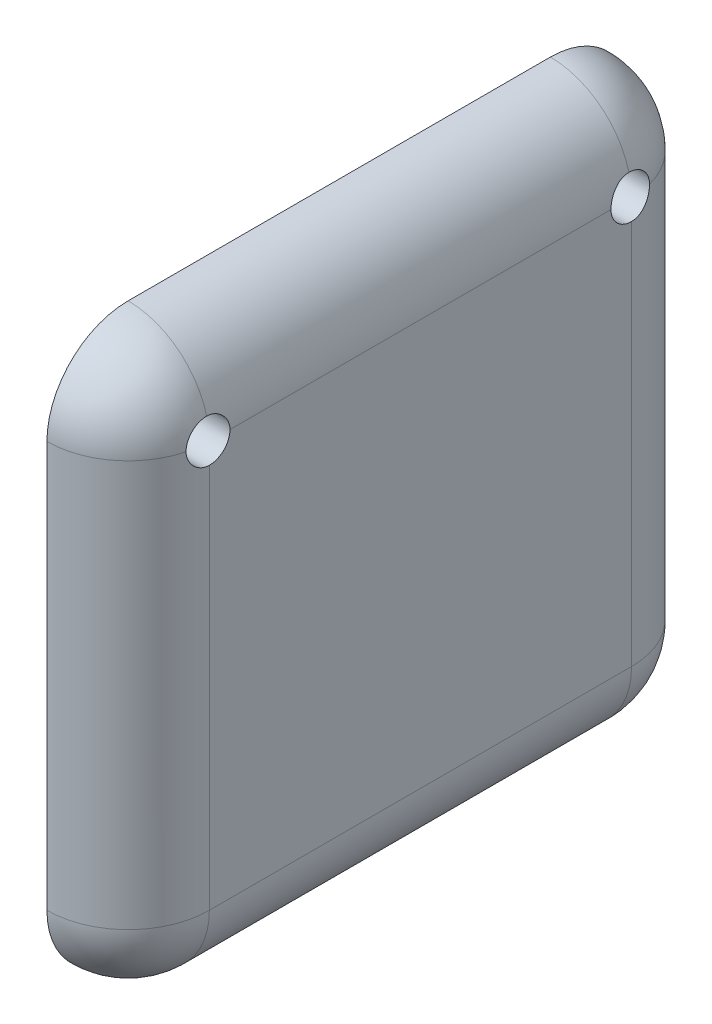
ISO-10303-21;
HEADER;
FILE_DESCRIPTION(('STEP AP214'),'2;1');
FILE_NAME('part.step','',(''),(''),'','','');
FILE_SCHEMA(('AUTOMOTIVE_DESIGN { 1 0 10303 214 1 1 1 1 }'));
ENDSEC;
DATA;
#1=APPLICATION_CONTEXT('core data for automotive mechanical design processes');
#2=APPLICATION_PROTOCOL_DEFINITION('international standard','automotive_design',2000,#1);
#3=PRODUCT_CONTEXT('',#1,'mechanical');
#4=PRODUCT('Part','Part','',(#3));
#5=PRODUCT_RELATED_PRODUCT_CATEGORY('part','',(#4));
#6=PRODUCT_DEFINITION_FORMATION('','',#4);
#7=PRODUCT_DEFINITION_CONTEXT('part definition',#1,'design');
#8=PRODUCT_DEFINITION('design','',#6,#7);
#9=PRODUCT_DEFINITION_SHAPE('','',#8);
#10=(LENGTH_UNIT() NAMED_UNIT(*) SI_UNIT(.MILLI.,.METRE.));
#11=(NAMED_UNIT(*) PLANE_ANGLE_UNIT() SI_UNIT($,.RADIAN.));
#12=(NAMED_UNIT(*) SI_UNIT($,.STERADIAN.) SOLID_ANGLE_UNIT());
#13=UNCERTAINTY_MEASURE_WITH_UNIT(LENGTH_MEASURE(1.E-05),#10,'distance_accuracy_value','');
#14=(GEOMETRIC_REPRESENTATION_CONTEXT(3) GLOBAL_UNCERTAINTY_ASSIGNED_CONTEXT((#13)) GLOBAL_UNIT_ASSIGNED_CONTEXT((#10,
#11,#12)) REPRESENTATION_CONTEXT('',''));
#15=CARTESIAN_POINT('',(0.,0.,0.));
#16=DIRECTION('',(0.,0.,1.));
#17=DIRECTION('',(1.,0.,0.));
#18=AXIS2_PLACEMENT_3D('',#15,#16,#17);
#19=CARTESIAN_POINT('',(105.,0.,0.));
#20=DIRECTION('',(1.,0.,0.));
#21=DIRECTION('',(0.,0.,-1.));
#22=AXIS2_PLACEMENT_3D('',#19,#20,#21);
#23=PLANE('',#22);
#24=CARTESIAN_POINT('',(105.,30.,-31.));
#25=DIRECTION('',(1.,0.,0.));
#26=DIRECTION('',(0.,0.,-1.));
#27=AXIS2_PLACEMENT_3D('',#24,#25,#26);
#28=CIRCLE('',#27,5.);
#29=CARTESIAN_POINT('',(105.,30.,-36.));
#30=VERTEX_POINT('',#29);
#31=CARTESIAN_POINT('',(105.,35.,-31.));
#32=VERTEX_POINT('',#31);
#33=EDGE_CURVE('E165',#30,#32,#28,.T.);
#34=ORIENTED_EDGE('',*,*,#33,.F.);
#35=DIRECTION('',(0.,-1.,0.));
#36=VECTOR('',#35,1.);
#37=CARTESIAN_POINT('',(105.,35.,-36.));
#38=LINE('',#37,#36);
#39=CARTESIAN_POINT('',(105.,5.,-36.));
#40=VERTEX_POINT('',#39);
#41=EDGE_CURVE('E141',#30,#40,#38,.T.);
#42=ORIENTED_EDGE('',*,*,#41,.T.);
#43=CARTESIAN_POINT('',(105.,5.,-31.));
#44=DIRECTION('',(1.,0.,0.));
#45=DIRECTION('',(0.,0.,-1.));
#46=AXIS2_PLACEMENT_3D('',#43,#44,#45);
#47=CIRCLE('',#46,5.);
#48=CARTESIAN_POINT('',(105.,0.,-31.));
#49=VERTEX_POINT('',#48);
#50=EDGE_CURVE('E149',#49,#40,#47,.T.);
#51=ORIENTED_EDGE('',*,*,#50,.F.);
#52=DIRECTION('',(0.,0.,-1.));
#53=VECTOR('',#52,1.);
#54=CARTESIAN_POINT('',(105.,0.,0.));
#55=LINE('',#54,#53);
#56=CARTESIAN_POINT('',(105.,0.,-5.));
#57=VERTEX_POINT('',#56);
#58=EDGE_CURVE('E11',#49,#57,#55,.F.);
#59=ORIENTED_EDGE('',*,*,#58,.T.);
#60=CARTESIAN_POINT('',(105.,5.,-5.));
#61=DIRECTION('',(1.,0.,0.));
#62=DIRECTION('',(0.,0.,-1.));
#63=AXIS2_PLACEMENT_3D('',#60,#61,#62);
#64=CIRCLE('',#63,5.);
#65=CARTESIAN_POINT('',(105.,5.,0.));
#66=VERTEX_POINT('',#65);
#67=EDGE_CURVE('E157',#66,#57,#64,.T.);
#68=ORIENTED_EDGE('',*,*,#67,.F.);
#69=DIRECTION('',(0.,-1.,0.));
#70=VECTOR('',#69,1.);
#71=CARTESIAN_POINT('',(105.,35.,0.));
#72=LINE('',#71,#70);
#73=CARTESIAN_POINT('',(105.,30.,0.));
#74=VERTEX_POINT('',#73);
#75=EDGE_CURVE('E42',#66,#74,#72,.F.);
#76=ORIENTED_EDGE('',*,*,#75,.T.);
#77=CARTESIAN_POINT('',(105.,30.,-5.));
#78=DIRECTION('',(1.,0.,0.));
#79=DIRECTION('',(0.,0.,-1.));
#80=AXIS2_PLACEMENT_3D('',#77,#78,#79);
#81=CIRCLE('',#80,5.);
#82=CARTESIAN_POINT('',(105.,35.,-5.));
#83=VERTEX_POINT('',#82);
#84=EDGE_CURVE('E131',#83,#74,#81,.T.);
#85=ORIENTED_EDGE('',*,*,#84,.F.);
#86=DIRECTION('',(0.,0.,-1.));
#87=VECTOR('',#86,1.);
#88=CARTESIAN_POINT('',(105.,35.,-36.));
#89=LINE('',#88,#87);
#90=EDGE_CURVE('E139',#83,#32,#89,.T.);
#91=ORIENTED_EDGE('',*,*,#90,.T.);
#92=EDGE_LOOP('',(#34,#42,#51,#59,#68,#76,#85,#91));
#93=FACE_BOUND('',#92,.T.);
#94=CARTESIAN_POINT('',(105.,30.,-31.));
#95=DIRECTION('',(1.,0.,0.));
#96=DIRECTION('',(0.,0.,-1.));
#97=AXIS2_PLACEMENT_3D('',#94,#95,#96);
#98=CIRCLE('',#97,1.26999999999999);
#99=CARTESIAN_POINT('',(105.,30.,-32.27));
#100=VERTEX_POINT('',#99);
#101=EDGE_CURVE('E224',#100,#100,#98,.F.);
#102=ORIENTED_EDGE('',*,*,#101,.F.);
#103=EDGE_LOOP('',(#102));
#104=FACE_BOUND('',#103,.T.);
#105=CARTESIAN_POINT('',(105.,30.,-5.));
#106=DIRECTION('',(1.,0.,0.));
#107=DIRECTION('',(0.,0.,-1.));
#108=AXIS2_PLACEMENT_3D('',#105,#106,#107);
#109=CIRCLE('',#108,1.27);
#110=CARTESIAN_POINT('',(105.,30.,-6.27));
#111=VERTEX_POINT('',#110);
#112=EDGE_CURVE('E37',#111,#111,#109,.F.);
#113=ORIENTED_EDGE('',*,*,#112,.F.);
#114=EDGE_LOOP('',(#113));
#115=FACE_BOUND('',#114,.T.);
#116=ADVANCED_FACE('F32',(#93,#104,#115),#23,.F.);
#117=CARTESIAN_POINT('',(105.,35.,-5.));
#118=DIRECTION('',(0.,-1.,0.));
#119=DIRECTION('',(0.,0.,-1.));
#120=AXIS2_PLACEMENT_3D('',#117,#118,#119);
#121=CYLINDRICAL_SURFACE('',#120,5.);
#122=CARTESIAN_POINT('',(109.836021091765,30.,-3.73));
#123=CARTESIAN_POINT('',(109.836018682015,29.964886353621,-3.72999954996035));
#124=CARTESIAN_POINT('',(109.83640401047,29.929790125857,-3.73145719031254));
#125=CARTESIAN_POINT('',(109.837925260273,29.8598605569281,-3.7372678020137));
#126=CARTESIAN_POINT('',(109.83906105218,29.8250271714756,-3.74162027406041));
#127=CARTESIAN_POINT('',(109.84354813022,29.7214501470163,-3.75895510336276));
#128=CARTESIAN_POINT('',(109.847979411318,29.6534188496602,-3.77621516581165));
#129=CARTESIAN_POINT('',(109.859204657676,29.5213402483421,-3.82158220907149));
#130=CARTESIAN_POINT('',(109.865998397974,29.457292565729,-3.8496881571224));
#131=CARTESIAN_POINT('',(109.881179325348,29.3347862564727,-3.91591563190485));
#132=CARTESIAN_POINT('',(109.889567010679,29.2763293860869,-3.95404029183934));
#133=CARTESIAN_POINT('',(109.907201284053,29.1653797293146,-4.04013530048998));
#134=CARTESIAN_POINT('',(109.916461853657,29.1130321405775,-4.08828984297089));
#135=CARTESIAN_POINT('',(109.934678547864,29.0170568437099,-4.19268927489099));
#136=CARTESIAN_POINT('',(109.943634614363,28.9734307921426,-4.24893569781452));
#137=CARTESIAN_POINT('',(109.960390523485,28.8955332213483,-4.36893307491363));
#138=CARTESIAN_POINT('',(109.968171426301,28.8614087008485,-4.43278222438062));
#139=CARTESIAN_POINT('',(109.98153261531,28.8044510959164,-4.56552444706138));
#140=CARTESIAN_POINT('',(109.987114616246,28.7816092095378,-4.63441354012606));
#141=CARTESIAN_POINT('',(109.994132491935,28.7532500300554,-4.7530557075887));
#142=CARTESIAN_POINT('',(109.996319870113,28.7445450134478,-4.80202595161099));
#143=CARTESIAN_POINT('',(109.999259232474,28.732916260234,-4.90065542043757));
#144=CARTESIAN_POINT('',(110.000012202713,28.7299885520806,-4.95031414828624));
#145=CARTESIAN_POINT('',(110.,28.73,-5.));
#146=B_SPLINE_CURVE_WITH_KNOTS('',3,(#122,#123,#124,#125,#126,#127,#128,#129,#130,#131,#132,
#133,#134,#135,#136,#137,#138,#139,#140,#141,#142,#143,#144,#145),.UNSPECIFIED.,.F.,.F.,(4,2,2,
2,2,2,2,2,2,2,2,4),(0.,0.105274329229653,0.210530505388591,0.420418751085676,0.630287015867145,
0.840220992092609,1.05441756601242,1.26865478571761,1.48604249991011,1.70326035403353,
1.85227764363053,2.0011924571944),.UNSPECIFIED.);
#147=CARTESIAN_POINT('',(109.836021091765,30.,-3.73));
#148=VERTEX_POINT('',#147);
#149=CARTESIAN_POINT('',(110.,28.73,-5.));
#150=VERTEX_POINT('',#149);
#151=EDGE_CURVE('E135',#148,#150,#146,.T.);
#152=ORIENTED_EDGE('',*,*,#151,.F.);
#153=CARTESIAN_POINT('',(105.,30.,-5.));
#154=DIRECTION('',(0.,1.,0.));
#155=DIRECTION('',(0.,0.,1.));
#156=AXIS2_PLACEMENT_3D('',#153,#154,#155);
#157=CIRCLE('',#156,5.);
#158=EDGE_CURVE('E162',#148,#74,#157,.F.);
#159=ORIENTED_EDGE('',*,*,#158,.T.);
#160=ORIENTED_EDGE('',*,*,#75,.F.);
#161=CARTESIAN_POINT('',(105.,5.,-5.));
#162=DIRECTION('',(0.,-1.,0.));
#163=DIRECTION('',(0.,0.,-1.));
#164=AXIS2_PLACEMENT_3D('',#161,#162,#163);
#165=CIRCLE('',#164,5.);
#166=CARTESIAN_POINT('',(110.,5.,-5.));
#167=VERTEX_POINT('',#166);
#168=EDGE_CURVE('E154',#167,#66,#165,.T.);
#169=ORIENTED_EDGE('',*,*,#168,.F.);
#170=DIRECTION('',(0.,-1.,0.));
#171=VECTOR('',#170,1.);
#172=CARTESIAN_POINT('',(110.,35.,-5.));
#173=LINE('',#172,#171);
#174=EDGE_CURVE('E127',#150,#167,#173,.T.);
#175=ORIENTED_EDGE('',*,*,#174,.F.);
#176=EDGE_LOOP('',(#152,#159,#160,#169,#175));
#177=FACE_BOUND('',#176,.T.);
#178=ADVANCED_FACE('F186',(#177),#121,.T.);
#179=CARTESIAN_POINT('',(105.,30.,-5.));
#180=DIRECTION('',(0.,0.,1.));
#181=DIRECTION('',(1.,0.,0.));
#182=AXIS2_PLACEMENT_3D('',#179,#180,#181);
#183=SPHERICAL_SURFACE('',#182,5.);
#184=CARTESIAN_POINT('',(109.836021091765,30.,-5.));
#185=DIRECTION('',(-1.,0.,0.));
#186=DIRECTION('',(0.,0.,1.));
#187=AXIS2_PLACEMENT_3D('',#184,#185,#186);
#188=CIRCLE('',#187,1.27);
#189=CARTESIAN_POINT('',(109.836021091765,31.27,-5.));
#190=VERTEX_POINT('',#189);
#191=EDGE_CURVE('E58',#190,#148,#188,.F.);
#192=ORIENTED_EDGE('',*,*,#191,.F.);
#193=CARTESIAN_POINT('',(105.,30.,-5.));
#194=DIRECTION('',(0.,0.,1.));
#195=DIRECTION('',(0.,-1.,0.));
#196=AXIS2_PLACEMENT_3D('',#193,#194,#195);
#197=CIRCLE('',#196,5.);
#198=EDGE_CURVE('E170',#190,#83,#197,.T.);
#199=ORIENTED_EDGE('',*,*,#198,.T.);
#200=ORIENTED_EDGE('',*,*,#84,.T.);
#201=ORIENTED_EDGE('',*,*,#158,.F.);
#202=EDGE_LOOP('',(#192,#199,#200,#201));
#203=FACE_BOUND('',#202,.T.);
#204=ADVANCED_FACE('F236',(#203),#183,.T.);
#205=CARTESIAN_POINT('',(105.,30.,-31.));
#206=DIRECTION('',(0.,0.,1.));
#207=DIRECTION('',(1.,0.,0.));
#208=AXIS2_PLACEMENT_3D('',#205,#206,#207);
#209=SPHERICAL_SURFACE('',#208,5.);
#210=CARTESIAN_POINT('',(109.836021091765,30.,-31.));
#211=DIRECTION('',(-1.,0.,0.));
#212=DIRECTION('',(0.,0.,1.));
#213=AXIS2_PLACEMENT_3D('',#210,#211,#212);
#214=CIRCLE('',#213,1.26999999999999);
#215=CARTESIAN_POINT('',(109.836021091765,30.,-32.27));
#216=VERTEX_POINT('',#215);
#217=CARTESIAN_POINT('',(109.836021091765,31.27,-31.));
#218=VERTEX_POINT('',#217);
#219=EDGE_CURVE('E107',#216,#218,#214,.F.);
#220=ORIENTED_EDGE('',*,*,#219,.F.);
#221=CARTESIAN_POINT('',(105.,30.,-31.));
#222=DIRECTION('',(0.,1.,0.));
#223=DIRECTION('',(0.,0.,1.));
#224=AXIS2_PLACEMENT_3D('',#221,#222,#223);
#225=CIRCLE('',#224,5.);
#226=EDGE_CURVE('E159',#30,#216,#225,.F.);
#227=ORIENTED_EDGE('',*,*,#226,.F.);
#228=ORIENTED_EDGE('',*,*,#33,.T.);
#229=CARTESIAN_POINT('',(105.,30.,-31.));
#230=DIRECTION('',(0.,0.,-1.));
#231=DIRECTION('',(-1.,0.,0.));
#232=AXIS2_PLACEMENT_3D('',#229,#230,#231);
#233=CIRCLE('',#232,5.);
#234=EDGE_CURVE('E168',#32,#218,#233,.T.);
#235=ORIENTED_EDGE('',*,*,#234,.T.);
#236=EDGE_LOOP('',(#220,#227,#228,#235));
#237=FACE_BOUND('',#236,.T.);
#238=ADVANCED_FACE('F249',(#237),#209,.T.);
#239=CARTESIAN_POINT('',(105.,35.,-31.));
#240=DIRECTION('',(0.,-1.,0.));
#241=DIRECTION('',(0.,0.,-1.));
#242=AXIS2_PLACEMENT_3D('',#239,#240,#241);
#243=CYLINDRICAL_SURFACE('',#242,5.);
#244=CARTESIAN_POINT('',(110.,28.73,-31.));
#245=CARTESIAN_POINT('',(110.000002032956,28.7299995996187,-31.0351321659607));
#246=CARTESIAN_POINT('',(109.999629266702,28.7314587312449,-31.0702469753213));
#247=CARTESIAN_POINT('',(109.998155780873,28.7372756058333,-31.1402147633546));
#248=CARTESIAN_POINT('',(109.997055176947,28.7416328882991,-31.1750677827344));
#249=CARTESIAN_POINT('',(109.992702269919,28.758988553853,-31.2787106859159));
#250=CARTESIAN_POINT('',(109.988398622583,28.7762710338951,-31.3467896044364));
#251=CARTESIAN_POINT('',(109.977449427962,28.8217032861913,-31.4789661902547));
#252=CARTESIAN_POINT('',(109.970803962473,28.8498526788867,-31.5430639965137));
#253=CARTESIAN_POINT('',(109.955877361307,28.9161817712107,-31.6656534732563));
#254=CARTESIAN_POINT('',(109.947595778653,28.9543642127523,-31.724143605256));
#255=CARTESIAN_POINT('',(109.930100995623,29.0405188259082,-31.8350573889194));
#256=CARTESIAN_POINT('',(109.920873163783,29.0886621435057,-31.8873457295386));
#257=CARTESIAN_POINT('',(109.902620878947,29.1930144880968,-31.9832062749794));
#258=CARTESIAN_POINT('',(109.893596471862,29.2492253152075,-32.0267765293112));
#259=CARTESIAN_POINT('',(109.876622557398,29.369188431991,-32.1046128484418));
#260=CARTESIAN_POINT('',(109.868692111364,29.4330451012586,-32.1387224043326));
#261=CARTESIAN_POINT('',(109.855026687855,29.5658019089936,-32.1956496106856));
#262=CARTESIAN_POINT('',(109.849289916394,29.6346978711573,-32.2184764926021));
#263=CARTESIAN_POINT('',(109.842070127991,29.7532993442147,-32.2467959756723));
#264=CARTESIAN_POINT('',(109.839816541059,29.802218613147,-32.2554832706852));
#265=CARTESIAN_POINT('',(109.836785542432,29.900749668177,-32.2670892556901));
#266=CARTESIAN_POINT('',(109.836007208263,29.9503610019617,-32.2700115505749));
#267=CARTESIAN_POINT('',(109.836021091765,30.,-32.27));
#268=B_SPLINE_CURVE_WITH_KNOTS('',3,(#244,#245,#246,#247,#248,#249,#250,#251,#252,#253,#254,
#255,#256,#257,#258,#259,#260,#261,#262,#263,#264,#265,#266,#267),.UNSPECIFIED.,.F.,.F.,(4,2,2,
2,2,2,2,2,2,2,2,4),(0.,0.105330059980314,0.210643387725728,0.420662498770925,0.630674274948834,
0.840743504650462,1.05477698383368,1.26885829513098,1.48629453405158,1.70355257148926,
1.85241892574379,2.00119216333591),.UNSPECIFIED.);
#269=CARTESIAN_POINT('',(110.,28.73,-31.));
#270=VERTEX_POINT('',#269);
#271=EDGE_CURVE('E180',#270,#216,#268,.T.);
#272=ORIENTED_EDGE('',*,*,#271,.F.);
#273=DIRECTION('',(0.,-1.,0.));
#274=VECTOR('',#273,1.);
#275=CARTESIAN_POINT('',(110.,35.,-31.));
#276=LINE('',#275,#274);
#277=CARTESIAN_POINT('',(110.,5.,-31.));
#278=VERTEX_POINT('',#277);
#279=EDGE_CURVE('E122',#278,#270,#276,.F.);
#280=ORIENTED_EDGE('',*,*,#279,.F.);
#281=CARTESIAN_POINT('',(105.,5.,-31.));
#282=DIRECTION('',(0.,-1.,0.));
#283=DIRECTION('',(0.,0.,-1.));
#284=AXIS2_PLACEMENT_3D('',#281,#282,#283);
#285=CIRCLE('',#284,5.);
#286=EDGE_CURVE('E151',#40,#278,#285,.T.);
#287=ORIENTED_EDGE('',*,*,#286,.F.);
#288=ORIENTED_EDGE('',*,*,#41,.F.);
#289=ORIENTED_EDGE('',*,*,#226,.T.);
#290=EDGE_LOOP('',(#272,#280,#287,#288,#289));
#291=FACE_BOUND('',#290,.T.);
#292=ADVANCED_FACE('F222',(#291),#243,.T.);
#293=CARTESIAN_POINT('',(110.,35.,-36.));
#294=DIRECTION('',(-1.,0.,0.));
#295=DIRECTION('',(0.,0.,1.));
#296=AXIS2_PLACEMENT_3D('',#293,#294,#295);
#297=PLANE('',#296);
#298=ORIENTED_EDGE('',*,*,#279,.T.);
#299=CARTESIAN_POINT('',(110.,30.,-31.));
#300=DIRECTION('',(1.,0.,0.));
#301=DIRECTION('',(0.,0.,-1.));
#302=AXIS2_PLACEMENT_3D('',#299,#300,#301);
#303=CIRCLE('',#302,1.26999999999999);
#304=CARTESIAN_POINT('',(110.,30.,-29.73));
#305=VERTEX_POINT('',#304);
#306=EDGE_CURVE('E50',#305,#270,#303,.T.);
#307=ORIENTED_EDGE('',*,*,#306,.F.);
#308=DIRECTION('',(0.,0.,-1.));
#309=VECTOR('',#308,1.);
#310=CARTESIAN_POINT('',(110.,30.,0.));
#311=LINE('',#310,#309);
#312=CARTESIAN_POINT('',(110.,30.,-6.27));
#313=VERTEX_POINT('',#312);
#314=EDGE_CURVE('E118',#305,#313,#311,.F.);
#315=ORIENTED_EDGE('',*,*,#314,.T.);
#316=CARTESIAN_POINT('',(110.,30.,-5.));
#317=DIRECTION('',(1.,0.,0.));
#318=DIRECTION('',(0.,0.,-1.));
#319=AXIS2_PLACEMENT_3D('',#316,#317,#318);
#320=CIRCLE('',#319,1.27);
#321=EDGE_CURVE('E112',#150,#313,#320,.T.);
#322=ORIENTED_EDGE('',*,*,#321,.F.);
#323=ORIENTED_EDGE('',*,*,#174,.T.);
#324=DIRECTION('',(0.,0.,-1.));
#325=VECTOR('',#324,1.);
#326=CARTESIAN_POINT('',(110.,5.,-36.));
#327=LINE('',#326,#325);
#328=EDGE_CURVE('E129',#167,#278,#327,.T.);
#329=ORIENTED_EDGE('',*,*,#328,.T.);
#330=EDGE_LOOP('',(#298,#307,#315,#322,#323,#329));
#331=FACE_BOUND('',#330,.T.);
#332=ADVANCED_FACE('F116',(#331),#297,.F.);
#333=CARTESIAN_POINT('',(105.,30.,0.));
#334=DIRECTION('',(0.,0.,1.));
#335=DIRECTION('',(1.,0.,0.));
#336=AXIS2_PLACEMENT_3D('',#333,#334,#335);
#337=CYLINDRICAL_SURFACE('',#336,5.);
#338=CARTESIAN_POINT('',(110.,30.,-32.27));
#339=CARTESIAN_POINT('',(109.99999883997,30.0701316315331,-32.2699980993432));
#340=CARTESIAN_POINT('',(109.99850980752,30.1402842819931,-32.2641712845524));
#341=CARTESIAN_POINT('',(109.992714120977,30.2785765787484,-32.2410543708596));
#342=CARTESIAN_POINT('',(109.988405926644,30.3467151033512,-32.2237580055384));
#343=CARTESIAN_POINT('',(109.97744861749,30.4789623186508,-32.1782946171266));
#344=CARTESIAN_POINT('',(109.970802363611,30.5430758220404,-32.1501408755219));
#345=CARTESIAN_POINT('',(109.955875484406,30.6656701820372,-32.0838092353333));
#346=CARTESIAN_POINT('',(109.947594791126,30.724150804307,-32.045630919956));
#347=CARTESIAN_POINT('',(109.930100505291,30.8350595413592,-31.9594787636149));
#348=CARTESIAN_POINT('',(109.920872149873,30.8873511838664,-31.9113322240246));
#349=CARTESIAN_POINT('',(109.902619931797,30.9832111176298,-31.8069799351616));
#350=CARTESIAN_POINT('',(109.89359609307,31.0267783926587,-31.7507732483381));
#351=CARTESIAN_POINT('',(109.876625281203,31.1046002297557,-31.6308295587422));
#352=CARTESIAN_POINT('',(109.868697023078,31.1387011129147,-31.5669899567965));
#353=CARTESIAN_POINT('',(109.855030751972,31.1956335167352,-31.4342501929952));
#354=CARTESIAN_POINT('',(109.849292376411,31.2184669031537,-31.3653508711382));
#355=CARTESIAN_POINT('',(109.840807483132,31.2517486174956,-31.225950678369));
#356=CARTESIAN_POINT('',(109.838001666032,31.2624428127211,-31.1555122023565));
#357=CARTESIAN_POINT('',(109.835522151449,31.2719085794356,-31.0137893678132));
#358=CARTESIAN_POINT('',(109.835847926863,31.2706821573807,-30.9425051536527));
#359=CARTESIAN_POINT('',(109.839541538793,31.2565374411201,-30.8030067686912));
#360=CARTESIAN_POINT('',(109.842832868489,31.2439131774455,-30.7347604405892));
#361=CARTESIAN_POINT('',(109.851964678013,31.2078006194465,-30.6013875741853));
#362=CARTESIAN_POINT('',(109.857805344652,31.1843115289583,-30.5362612649013));
#363=CARTESIAN_POINT('',(109.871447259726,31.1268881068706,-30.4101938755027));
#364=CARTESIAN_POINT('',(109.879268223225,31.0928479195515,-30.349303235564));
#365=CARTESIAN_POINT('',(109.895978502086,31.0153625678844,-30.2339933581722));
#366=CARTESIAN_POINT('',(109.904868009798,30.9719157090975,-30.1795752893737));
#367=CARTESIAN_POINT('',(109.923035026915,30.8753318712325,-30.0770714752657));
#368=CARTESIAN_POINT('',(109.932316250182,30.8219470476788,-30.0292196171579));
#369=CARTESIAN_POINT('',(109.949985000961,30.7077986770059,-29.9431023961263));
#370=CARTESIAN_POINT('',(109.958372499407,30.6470348900479,-29.9048373449271));
#371=CARTESIAN_POINT('',(109.973352721916,30.5195130700814,-29.8388900840623));
#372=CARTESIAN_POINT('',(109.979938805796,30.452734034862,-29.8112468799528));
#373=CARTESIAN_POINT('',(109.990525914762,30.315271993567,-29.767644543123));
#374=CARTESIAN_POINT('',(109.994527450749,30.2445897620564,-29.7516831011275));
#375=CARTESIAN_POINT('',(109.999418604819,30.1033265721468,-29.7322569197495));
#376=CARTESIAN_POINT('',(110.000387487786,30.0327920766956,-29.7284737970494));
#377=CARTESIAN_POINT('',(109.999330429511,29.8920975065363,-29.732636992004));
#378=CARTESIAN_POINT('',(109.997304767148,29.8219373975728,-29.7405822174144));
#379=CARTESIAN_POINT('',(109.990537116625,29.685096588437,-29.7677144240186));
#380=CARTESIAN_POINT('',(109.985837343058,29.6183789907631,-29.78672679981));
#381=CARTESIAN_POINT('',(109.974251922502,29.4890842740852,-29.835253398613));
#382=CARTESIAN_POINT('',(109.967366050731,29.4265075816619,-29.8647687016059));
#383=CARTESIAN_POINT('',(109.95198335705,29.306011190824,-29.9340741211262));
#384=CARTESIAN_POINT('',(109.94345951147,29.2481969024338,-29.9740413628686));
#385=CARTESIAN_POINT('',(109.92578747324,29.1399830215545,-30.0628906191654));
#386=CARTESIAN_POINT('',(109.916639169362,29.0895847550689,-30.1117742244974));
#387=CARTESIAN_POINT('',(109.898462457839,28.9963144905629,-30.2185487395089));
#388=CARTESIAN_POINT('',(109.889442996506,28.9536661544682,-30.2766368838812));
#389=CARTESIAN_POINT('',(109.872803531112,28.8787216255167,-30.3993324277555));
#390=CARTESIAN_POINT('',(109.865183465489,28.8464249772144,-30.4639395402766));
#391=CARTESIAN_POINT('',(109.852290567381,28.7933423250909,-30.5974967622535));
#392=CARTESIAN_POINT('',(109.847003892152,28.7724882540694,-30.6664184114631));
#393=CARTESIAN_POINT('',(109.839365195408,28.7427071418771,-30.8069450147475));
#394=CARTESIAN_POINT('',(109.837012507243,28.7337773912749,-30.8785493554612));
#395=CARTESIAN_POINT('',(109.835560136939,28.7282433879448,-31.020129601189));
#396=CARTESIAN_POINT('',(109.836365984081,28.7312812034593,-31.0900907668026));
#397=CARTESIAN_POINT('',(109.840920816134,28.7487743122102,-31.2284681695144));
#398=CARTESIAN_POINT('',(109.844669738159,28.7632293614909,-31.2968844395907));
#399=CARTESIAN_POINT('',(109.854634802431,28.8029482324747,-31.429826418981));
#400=CARTESIAN_POINT('',(109.860835135556,28.8281428744773,-31.4943740639554));
#401=CARTESIAN_POINT('',(109.875006169074,28.8885713145903,-31.6183729450643));
#402=CARTESIAN_POINT('',(109.88297712275,28.9238065491904,-31.6778234503758));
#403=CARTESIAN_POINT('',(109.900058927485,29.0044293278204,-31.7916651792213));
#404=CARTESIAN_POINT('',(109.90919465692,29.0500642750181,-31.8458774864545));
#405=CARTESIAN_POINT('',(109.927430441207,29.1497116620865,-31.9459911816675));
#406=CARTESIAN_POINT('',(109.936530487025,29.2037260986217,-31.9918905831838));
#407=CARTESIAN_POINT('',(109.953874507306,29.3198288162769,-32.0749213767875));
#408=CARTESIAN_POINT('',(109.962099097266,29.3820501678359,-32.1118710593052));
#409=CARTESIAN_POINT('',(109.97655933603,29.5120255269388,-32.174727165139));
#410=CARTESIAN_POINT('',(109.982796374777,29.579775626267,-32.2006413101524));
#411=CARTESIAN_POINT('',(109.991683576997,29.7061460656336,-32.2369526850643));
#412=CARTESIAN_POINT('',(109.994780511769,29.7641772873011,-32.2493181817251));
#413=CARTESIAN_POINT('',(109.998939131732,29.8814674005201,-32.2658423127228));
#414=CARTESIAN_POINT('',(110.000000980434,29.9407261930546,-32.2700016063959));
#415=CARTESIAN_POINT('',(110.,30.,-32.27));
#416=B_SPLINE_CURVE_WITH_KNOTS('',3,(#338,#339,#340,#341,#342,#343,#344,#345,#346,#347,#348,
#349,#350,#351,#352,#353,#354,#355,#356,#357,#358,#359,#360,#361,#362,#363,#364,#365,#366,#367,
#368,#369,#370,#371,#372,#373,#374,#375,#376,#377,#378,#379,#380,#381,#382,#383,#384,#385,#386,
#387,#388,#389,#390,#391,#392,#393,#394,#395,#396,#397,#398,#399,#400,#401,#402,#403,#404,#405,
#406,#407,#408,#409,#410,#411,#412,#413,#414,#415),.UNSPECIFIED.,.T.,.F.,(4,2,2,2,2,2,2,2,2,2,2,
2,2,2,2,2,2,2,2,2,2,2,2,2,2,2,2,2,2,2,2,2,2,2,2,2,2,2,4),(0.,0.210177641716542,
0.420470209256101,0.63050634435746,0.840551213547603,1.05459614996046,1.26866600415962,
1.48603114200553,1.70336027480662,1.91620436228179,2.12901262485897,2.3364831682485,
2.54396891728212,2.75360763774907,2.96328415224218,3.17914011000699,3.39500308563245,
3.61165134570177,3.82825676671092,4.03915133444968,4.25002626311884,4.45766109685196,
4.66531728716275,4.87675056901377,5.08822160985704,5.30506359081232,5.52189603001549,
5.73742423820478,5.95290346596333,6.16198768639903,6.37106743938818,6.57882027523842,
6.78660284885238,6.99996980684713,7.21338768422497,7.43083099907897,7.64812191525799,
7.82577399267323,8.00341179585872),.UNSPECIFIED.);
#417=EDGE_CURVE('E104',#218,#305,#416,.T.);
#418=ORIENTED_EDGE('',*,*,#417,.F.);
#419=ORIENTED_EDGE('',*,*,#234,.F.);
#420=ORIENTED_EDGE('',*,*,#90,.F.);
#421=ORIENTED_EDGE('',*,*,#198,.F.);
#422=CARTESIAN_POINT('',(110.,30.,-6.27));
#423=CARTESIAN_POINT('',(110.000002032956,30.0351321659607,-6.27000040038134));
#424=CARTESIAN_POINT('',(109.999629266702,30.0702469753213,-6.26854126875515));
#425=CARTESIAN_POINT('',(109.998155780873,30.1402147633546,-6.26272439416669));
#426=CARTESIAN_POINT('',(109.997055176947,30.1750677827344,-6.25836711170091));
#427=CARTESIAN_POINT('',(109.992702269919,30.2787106859159,-6.24101144614703));
#428=CARTESIAN_POINT('',(109.988398622583,30.3467896044364,-6.22372896610488));
#429=CARTESIAN_POINT('',(109.977449427962,30.4789661902547,-6.17829671380869));
#430=CARTESIAN_POINT('',(109.970803962473,30.5430639965137,-6.15014732111331));
#431=CARTESIAN_POINT('',(109.955877361307,30.6656534732563,-6.08381822878935));
#432=CARTESIAN_POINT('',(109.947595778653,30.724143605256,-6.0456357872477));
#433=CARTESIAN_POINT('',(109.930100995623,30.8350573889194,-5.95948117409176));
#434=CARTESIAN_POINT('',(109.920873163783,30.8873457295386,-5.91133785649434));
#435=CARTESIAN_POINT('',(109.902620878947,30.9832062749795,-5.80698551190323));
#436=CARTESIAN_POINT('',(109.893596471862,31.0267765293112,-5.75077468479254));
#437=CARTESIAN_POINT('',(109.876622557398,31.1046128484418,-5.63081156800902));
#438=CARTESIAN_POINT('',(109.868692111364,31.1387224043326,-5.56695489874136));
#439=CARTESIAN_POINT('',(109.855026687855,31.1956496106856,-5.43419809100644));
#440=CARTESIAN_POINT('',(109.849289916394,31.2184764926021,-5.36530212884267));
#441=CARTESIAN_POINT('',(109.842070127991,31.2467959756723,-5.2467006557853));
#442=CARTESIAN_POINT('',(109.839816541059,31.2554832706852,-5.19778138685302));
#443=CARTESIAN_POINT('',(109.836785542432,31.2670892556901,-5.09925033182304));
#444=CARTESIAN_POINT('',(109.836007208263,31.2700115505749,-5.04963899803835));
#445=CARTESIAN_POINT('',(109.836021091765,31.27,-5.));
#446=B_SPLINE_CURVE_WITH_KNOTS('',3,(#422,#423,#424,#425,#426,#427,#428,#429,#430,#431,#432,
#433,#434,#435,#436,#437,#438,#439,#440,#441,#442,#443,#444,#445),.UNSPECIFIED.,.F.,.F.,(4,2,2,
2,2,2,2,2,2,2,2,4),(0.,0.105330059980314,0.210643387725731,0.420662498770931,0.630674274948843,
0.840743504650473,1.05477698383369,1.268858295131,1.4862945340516,1.70355257148928,
1.8524189257438,2.00119216333592),.UNSPECIFIED.);
#447=EDGE_CURVE('E126',#313,#190,#446,.T.);
#448=ORIENTED_EDGE('',*,*,#447,.F.);
#449=ORIENTED_EDGE('',*,*,#314,.F.);
#450=EDGE_LOOP('',(#418,#419,#420,#421,#448,#449));
#451=FACE_BOUND('',#450,.T.);
#452=ADVANCED_FACE('F34',(#451),#337,.T.);
#453=CARTESIAN_POINT('',(90.,30.,-31.));
#454=DIRECTION('',(1.,0.,0.));
#455=DIRECTION('',(0.,0.,-1.));
#456=AXIS2_PLACEMENT_3D('',#453,#454,#455);
#457=CYLINDRICAL_SURFACE('',#456,1.26999999999999);
#458=ORIENTED_EDGE('',*,*,#101,.T.);
#459=EDGE_LOOP('',(#458));
#460=FACE_BOUND('',#459,.T.);
#461=ORIENTED_EDGE('',*,*,#417,.T.);
#462=ORIENTED_EDGE('',*,*,#306,.T.);
#463=ORIENTED_EDGE('',*,*,#271,.T.);
#464=ORIENTED_EDGE('',*,*,#219,.T.);
#465=EDGE_LOOP('',(#461,#462,#463,#464));
#466=FACE_BOUND('',#465,.T.);
#467=ADVANCED_FACE('F105',(#460,#466),#457,.F.);
#468=CARTESIAN_POINT('',(90.,30.,-5.));
#469=DIRECTION('',(1.,0.,0.));
#470=DIRECTION('',(0.,0.,-1.));
#471=AXIS2_PLACEMENT_3D('',#468,#469,#470);
#472=CYLINDRICAL_SURFACE('',#471,1.27);
#473=ORIENTED_EDGE('',*,*,#112,.T.);
#474=EDGE_LOOP('',(#473));
#475=FACE_BOUND('',#474,.T.);
#476=ORIENTED_EDGE('',*,*,#447,.T.);
#477=ORIENTED_EDGE('',*,*,#191,.T.);
#478=ORIENTED_EDGE('',*,*,#151,.T.);
#479=ORIENTED_EDGE('',*,*,#321,.T.);
#480=EDGE_LOOP('',(#476,#477,#478,#479));
#481=FACE_BOUND('',#480,.T.);
#482=ADVANCED_FACE('F189',(#475,#481),#472,.F.);
#483=CARTESIAN_POINT('',(105.,5.,-31.));
#484=DIRECTION('',(0.,0.,1.));
#485=DIRECTION('',(1.,0.,0.));
#486=AXIS2_PLACEMENT_3D('',#483,#484,#485);
#487=SPHERICAL_SURFACE('',#486,5.);
#488=ORIENTED_EDGE('',*,*,#50,.T.);
#489=ORIENTED_EDGE('',*,*,#286,.T.);
#490=CARTESIAN_POINT('',(105.,5.,-31.));
#491=DIRECTION('',(0.,0.,-1.));
#492=DIRECTION('',(-1.,0.,0.));
#493=AXIS2_PLACEMENT_3D('',#490,#491,#492);
#494=CIRCLE('',#493,5.);
#495=EDGE_CURVE('E144',#49,#278,#494,.F.);
#496=ORIENTED_EDGE('',*,*,#495,.F.);
#497=EDGE_LOOP('',(#488,#489,#496));
#498=FACE_BOUND('',#497,.T.);
#499=ADVANCED_FACE('F193',(#498),#487,.T.);
#500=CARTESIAN_POINT('',(105.,5.,-5.));
#501=DIRECTION('',(0.,0.,1.));
#502=DIRECTION('',(1.,0.,0.));
#503=AXIS2_PLACEMENT_3D('',#500,#501,#502);
#504=SPHERICAL_SURFACE('',#503,5.);
#505=ORIENTED_EDGE('',*,*,#168,.T.);
#506=ORIENTED_EDGE('',*,*,#67,.T.);
#507=CARTESIAN_POINT('',(105.,5.,-5.));
#508=DIRECTION('',(0.,0.,1.));
#509=DIRECTION('',(1.,0.,0.));
#510=AXIS2_PLACEMENT_3D('',#507,#508,#509);
#511=CIRCLE('',#510,5.);
#512=EDGE_CURVE('E146',#167,#57,#511,.F.);
#513=ORIENTED_EDGE('',*,*,#512,.F.);
#514=EDGE_LOOP('',(#505,#506,#513));
#515=FACE_BOUND('',#514,.T.);
#516=ADVANCED_FACE('F214',(#515),#504,.T.);
#517=CARTESIAN_POINT('',(105.,5.,-36.));
#518=DIRECTION('',(0.,0.,-1.));
#519=DIRECTION('',(-1.,0.,0.));
#520=AXIS2_PLACEMENT_3D('',#517,#518,#519);
#521=CYLINDRICAL_SURFACE('',#520,5.);
#522=ORIENTED_EDGE('',*,*,#512,.T.);
#523=ORIENTED_EDGE('',*,*,#58,.F.);
#524=ORIENTED_EDGE('',*,*,#495,.T.);
#525=ORIENTED_EDGE('',*,*,#328,.F.);
#526=EDGE_LOOP('',(#522,#523,#524,#525));
#527=FACE_BOUND('',#526,.T.);
#528=ADVANCED_FACE('F216',(#527),#521,.T.);
#529=CLOSED_SHELL('',(#116,#178,#204,#238,#292,#332,#452,#467,#482,#499,#516,#528));
#530=MANIFOLD_SOLID_BREP('B2',#529);
#531=ADVANCED_BREP_SHAPE_REPRESENTATION('',(#18,#530),#14);
#532=SHAPE_DEFINITION_REPRESENTATION(#9,#531);
ENDSEC;
END-ISO-10303-21;
